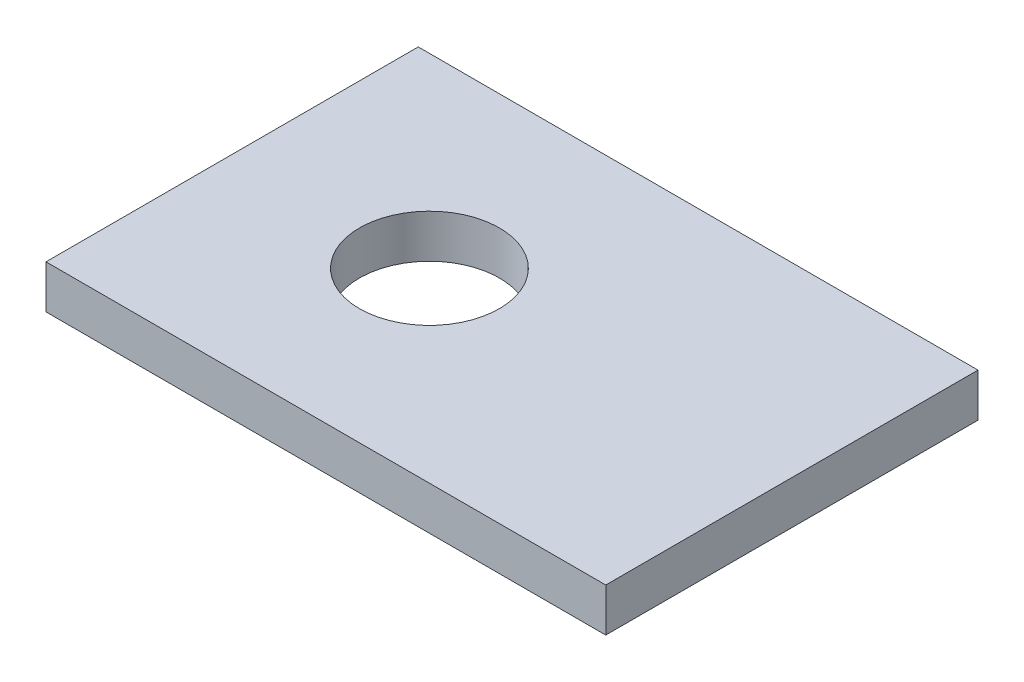
ISO-10303-21;
HEADER;
FILE_DESCRIPTION(('STEP AP214'),'2;1');
FILE_NAME('part.step','',(''),(''),'','','');
FILE_SCHEMA(('AUTOMOTIVE_DESIGN { 1 0 10303 214 1 1 1 1 }'));
ENDSEC;
DATA;
#1=APPLICATION_CONTEXT('core data for automotive mechanical design processes');
#2=APPLICATION_PROTOCOL_DEFINITION('international standard','automotive_design',2000,#1);
#3=PRODUCT_CONTEXT('',#1,'mechanical');
#4=PRODUCT('Part','Part','',(#3));
#5=PRODUCT_RELATED_PRODUCT_CATEGORY('part','',(#4));
#6=PRODUCT_DEFINITION_FORMATION('','',#4);
#7=PRODUCT_DEFINITION_CONTEXT('part definition',#1,'design');
#8=PRODUCT_DEFINITION('design','',#6,#7);
#9=PRODUCT_DEFINITION_SHAPE('','',#8);
#10=(LENGTH_UNIT() NAMED_UNIT(*) SI_UNIT(.MILLI.,.METRE.));
#11=(NAMED_UNIT(*) PLANE_ANGLE_UNIT() SI_UNIT($,.RADIAN.));
#12=(NAMED_UNIT(*) SI_UNIT($,.STERADIAN.) SOLID_ANGLE_UNIT());
#13=UNCERTAINTY_MEASURE_WITH_UNIT(LENGTH_MEASURE(1.E-05),#10,'distance_accuracy_value','');
#14=(GEOMETRIC_REPRESENTATION_CONTEXT(3) GLOBAL_UNCERTAINTY_ASSIGNED_CONTEXT((#13)) GLOBAL_UNIT_ASSIGNED_CONTEXT((#10,
#11,#12)) REPRESENTATION_CONTEXT('',''));
#15=CARTESIAN_POINT('',(0.,0.,0.));
#16=DIRECTION('',(0.,0.,1.));
#17=DIRECTION('',(1.,0.,0.));
#18=AXIS2_PLACEMENT_3D('',#15,#16,#17);
#19=CARTESIAN_POINT('',(0.,0.,13.3));
#20=DIRECTION('',(1.,0.,0.));
#21=DIRECTION('',(0.,0.,-1.));
#22=AXIS2_PLACEMENT_3D('',#19,#20,#21);
#23=PLANE('',#22);
#24=DIRECTION('',(0.,-1.,0.));
#25=VECTOR('',#24,1.);
#26=CARTESIAN_POINT('',(0.,0.,0.));
#27=LINE('',#26,#25);
#28=CARTESIAN_POINT('',(0.,0.,0.));
#29=VERTEX_POINT('',#28);
#30=CARTESIAN_POINT('',(0.,-1.55,0.));
#31=VERTEX_POINT('',#30);
#32=EDGE_CURVE('E97',#29,#31,#27,.T.);
#33=ORIENTED_EDGE('',*,*,#32,.T.);
#34=DIRECTION('',(0.,0.,-1.));
#35=VECTOR('',#34,1.);
#36=CARTESIAN_POINT('',(0.,-1.55,13.3));
#37=LINE('',#36,#35);
#38=CARTESIAN_POINT('',(0.,-1.55,13.3));
#39=VERTEX_POINT('',#38);
#40=EDGE_CURVE('E11',#39,#31,#37,.T.);
#41=ORIENTED_EDGE('',*,*,#40,.F.);
#42=DIRECTION('',(0.,-1.,0.));
#43=VECTOR('',#42,1.);
#44=CARTESIAN_POINT('',(0.,0.,13.3));
#45=LINE('',#44,#43);
#46=CARTESIAN_POINT('',(0.,0.,13.3));
#47=VERTEX_POINT('',#46);
#48=EDGE_CURVE('E85',#47,#39,#45,.T.);
#49=ORIENTED_EDGE('',*,*,#48,.F.);
#50=DIRECTION('',(0.,0.,-1.));
#51=VECTOR('',#50,1.);
#52=CARTESIAN_POINT('',(0.,0.,13.3));
#53=LINE('',#52,#51);
#54=EDGE_CURVE('E93',#47,#29,#53,.T.);
#55=ORIENTED_EDGE('',*,*,#54,.T.);
#56=EDGE_LOOP('',(#33,#41,#49,#55));
#57=FACE_BOUND('',#56,.T.);
#58=ADVANCED_FACE('F34',(#57),#23,.F.);
#59=CARTESIAN_POINT('',(0.,-1.55,13.3));
#60=DIRECTION('',(0.,1.,0.));
#61=DIRECTION('',(0.,0.,1.));
#62=AXIS2_PLACEMENT_3D('',#59,#60,#61);
#63=PLANE('',#62);
#64=CARTESIAN_POINT('',(7.05,-1.55,6.65));
#65=DIRECTION('',(0.,1.,0.));
#66=DIRECTION('',(0.,0.,1.));
#67=AXIS2_PLACEMENT_3D('',#64,#65,#66);
#68=CIRCLE('',#67,2.5);
#69=CARTESIAN_POINT('',(7.05,-1.55,9.15000000000001));
#70=VERTEX_POINT('',#69);
#71=EDGE_CURVE('E100',#70,#70,#68,.T.);
#72=ORIENTED_EDGE('',*,*,#71,.T.);
#73=EDGE_LOOP('',(#72));
#74=FACE_BOUND('',#73,.T.);
#75=DIRECTION('',(1.,0.,0.));
#76=VECTOR('',#75,1.);
#77=CARTESIAN_POINT('',(0.,-1.55,0.));
#78=LINE('',#77,#76);
#79=CARTESIAN_POINT('',(20.,-1.55,0.));
#80=VERTEX_POINT('',#79);
#81=EDGE_CURVE('E89',#31,#80,#78,.T.);
#82=ORIENTED_EDGE('',*,*,#81,.T.);
#83=DIRECTION('',(0.,0.,-1.));
#84=VECTOR('',#83,1.);
#85=CARTESIAN_POINT('',(20.,-1.55,13.3));
#86=LINE('',#85,#84);
#87=CARTESIAN_POINT('',(20.,-1.55,13.3));
#88=VERTEX_POINT('',#87);
#89=EDGE_CURVE('E42',#88,#80,#86,.T.);
#90=ORIENTED_EDGE('',*,*,#89,.F.);
#91=DIRECTION('',(1.,0.,0.));
#92=VECTOR('',#91,1.);
#93=CARTESIAN_POINT('',(0.,-1.55,13.3));
#94=LINE('',#93,#92);
#95=EDGE_CURVE('E80',#39,#88,#94,.T.);
#96=ORIENTED_EDGE('',*,*,#95,.F.);
#97=ORIENTED_EDGE('',*,*,#40,.T.);
#98=EDGE_LOOP('',(#82,#90,#96,#97));
#99=FACE_BOUND('',#98,.T.);
#100=ADVANCED_FACE('F88',(#74,#99),#63,.F.);
#101=CARTESIAN_POINT('',(20.,0.,13.3));
#102=DIRECTION('',(-1.,0.,0.));
#103=DIRECTION('',(0.,0.,1.));
#104=AXIS2_PLACEMENT_3D('',#101,#102,#103);
#105=PLANE('',#104);
#106=DIRECTION('',(0.,1.,0.));
#107=VECTOR('',#106,1.);
#108=CARTESIAN_POINT('',(20.,0.,0.));
#109=LINE('',#108,#107);
#110=CARTESIAN_POINT('',(20.,0.,0.));
#111=VERTEX_POINT('',#110);
#112=EDGE_CURVE('E67',#80,#111,#109,.T.);
#113=ORIENTED_EDGE('',*,*,#112,.T.);
#114=DIRECTION('',(0.,0.,-1.));
#115=VECTOR('',#114,1.);
#116=CARTESIAN_POINT('',(20.,0.,13.3));
#117=LINE('',#116,#115);
#118=CARTESIAN_POINT('',(20.,0.,13.3));
#119=VERTEX_POINT('',#118);
#120=EDGE_CURVE('E90',#119,#111,#117,.T.);
#121=ORIENTED_EDGE('',*,*,#120,.F.);
#122=DIRECTION('',(0.,1.,0.));
#123=VECTOR('',#122,1.);
#124=CARTESIAN_POINT('',(20.,0.,13.3));
#125=LINE('',#124,#123);
#126=EDGE_CURVE('E83',#88,#119,#125,.T.);
#127=ORIENTED_EDGE('',*,*,#126,.F.);
#128=ORIENTED_EDGE('',*,*,#89,.T.);
#129=EDGE_LOOP('',(#113,#121,#127,#128));
#130=FACE_BOUND('',#129,.T.);
#131=ADVANCED_FACE('F91',(#130),#105,.F.);
#132=CARTESIAN_POINT('',(0.,0.,13.3));
#133=DIRECTION('',(0.,-1.,0.));
#134=DIRECTION('',(0.,0.,-1.));
#135=AXIS2_PLACEMENT_3D('',#132,#133,#134);
#136=PLANE('',#135);
#137=CARTESIAN_POINT('',(7.05,0.,6.65));
#138=DIRECTION('',(0.,1.,0.));
#139=DIRECTION('',(0.,0.,1.));
#140=AXIS2_PLACEMENT_3D('',#137,#138,#139);
#141=CIRCLE('',#140,2.5);
#142=CARTESIAN_POINT('',(7.05,0.,9.15000000000001));
#143=VERTEX_POINT('',#142);
#144=EDGE_CURVE('E113',#143,#143,#141,.T.);
#145=ORIENTED_EDGE('',*,*,#144,.F.);
#146=EDGE_LOOP('',(#145));
#147=FACE_BOUND('',#146,.T.);
#148=DIRECTION('',(-1.,0.,0.));
#149=VECTOR('',#148,1.);
#150=CARTESIAN_POINT('',(0.,0.,0.));
#151=LINE('',#150,#149);
#152=EDGE_CURVE('E73',#111,#29,#151,.T.);
#153=ORIENTED_EDGE('',*,*,#152,.T.);
#154=ORIENTED_EDGE('',*,*,#54,.F.);
#155=DIRECTION('',(-1.,0.,0.));
#156=VECTOR('',#155,1.);
#157=CARTESIAN_POINT('',(0.,0.,13.3));
#158=LINE('',#157,#156);
#159=EDGE_CURVE('E50',#119,#47,#158,.T.);
#160=ORIENTED_EDGE('',*,*,#159,.F.);
#161=ORIENTED_EDGE('',*,*,#120,.T.);
#162=EDGE_LOOP('',(#153,#154,#160,#161));
#163=FACE_BOUND('',#162,.T.);
#164=ADVANCED_FACE('F105',(#147,#163),#136,.F.);
#165=CARTESIAN_POINT('',(0.,0.,13.3));
#166=DIRECTION('',(0.,0.,1.));
#167=DIRECTION('',(1.,0.,0.));
#168=AXIS2_PLACEMENT_3D('',#165,#166,#167);
#169=PLANE('',#168);
#170=ORIENTED_EDGE('',*,*,#48,.T.);
#171=ORIENTED_EDGE('',*,*,#95,.T.);
#172=ORIENTED_EDGE('',*,*,#126,.T.);
#173=ORIENTED_EDGE('',*,*,#159,.T.);
#174=EDGE_LOOP('',(#170,#171,#172,#173));
#175=FACE_BOUND('',#174,.T.);
#176=ADVANCED_FACE('F81',(#175),#169,.T.);
#177=CARTESIAN_POINT('',(0.,0.,0.));
#178=DIRECTION('',(0.,0.,1.));
#179=DIRECTION('',(1.,0.,0.));
#180=AXIS2_PLACEMENT_3D('',#177,#178,#179);
#181=PLANE('',#180);
#182=ORIENTED_EDGE('',*,*,#32,.F.);
#183=ORIENTED_EDGE('',*,*,#152,.F.);
#184=ORIENTED_EDGE('',*,*,#112,.F.);
#185=ORIENTED_EDGE('',*,*,#81,.F.);
#186=EDGE_LOOP('',(#182,#183,#184,#185));
#187=FACE_BOUND('',#186,.T.);
#188=ADVANCED_FACE('F108',(#187),#181,.F.);
#189=CARTESIAN_POINT('',(7.05,-10.,6.65));
#190=DIRECTION('',(0.,1.,0.));
#191=DIRECTION('',(0.,0.,1.));
#192=AXIS2_PLACEMENT_3D('',#189,#190,#191);
#193=CYLINDRICAL_SURFACE('',#192,2.5);
#194=ORIENTED_EDGE('',*,*,#144,.T.);
#195=EDGE_LOOP('',(#194));
#196=FACE_BOUND('',#195,.T.);
#197=ORIENTED_EDGE('',*,*,#71,.F.);
#198=EDGE_LOOP('',(#197));
#199=FACE_BOUND('',#198,.T.);
#200=ADVANCED_FACE('F117',(#196,#199),#193,.F.);
#201=CLOSED_SHELL('',(#58,#100,#131,#164,#176,#188,#200));
#202=MANIFOLD_SOLID_BREP('B2',#201);
#203=ADVANCED_BREP_SHAPE_REPRESENTATION('',(#18,#202),#14);
#204=SHAPE_DEFINITION_REPRESENTATION(#9,#203);
ENDSEC;
END-ISO-10303-21;
